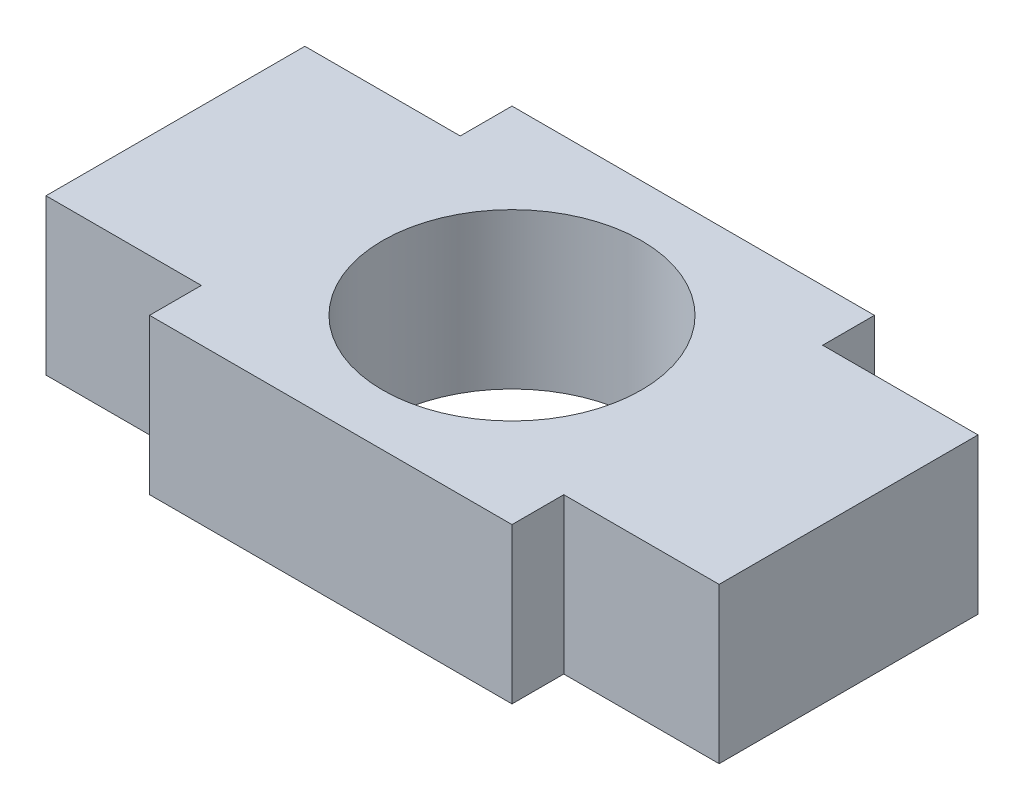
ISO-10303-21;
HEADER;
FILE_DESCRIPTION(('STEP AP214'),'2;1');
FILE_NAME('part.step','',(''),(''),'','','');
FILE_SCHEMA(('AUTOMOTIVE_DESIGN { 1 0 10303 214 1 1 1 1 }'));
ENDSEC;
DATA;
#1=APPLICATION_CONTEXT('core data for automotive mechanical design processes');
#2=APPLICATION_PROTOCOL_DEFINITION('international standard','automotive_design',2000,#1);
#3=PRODUCT_CONTEXT('',#1,'mechanical');
#4=PRODUCT('Part','Part','',(#3));
#5=PRODUCT_RELATED_PRODUCT_CATEGORY('part','',(#4));
#6=PRODUCT_DEFINITION_FORMATION('','',#4);
#7=PRODUCT_DEFINITION_CONTEXT('part definition',#1,'design');
#8=PRODUCT_DEFINITION('design','',#6,#7);
#9=PRODUCT_DEFINITION_SHAPE('','',#8);
#10=(LENGTH_UNIT() NAMED_UNIT(*) SI_UNIT(.MILLI.,.METRE.));
#11=(NAMED_UNIT(*) PLANE_ANGLE_UNIT() SI_UNIT($,.RADIAN.));
#12=(NAMED_UNIT(*) SI_UNIT($,.STERADIAN.) SOLID_ANGLE_UNIT());
#13=UNCERTAINTY_MEASURE_WITH_UNIT(LENGTH_MEASURE(1.E-05),#10,'distance_accuracy_value','');
#14=(GEOMETRIC_REPRESENTATION_CONTEXT(3) GLOBAL_UNCERTAINTY_ASSIGNED_CONTEXT((#13)) GLOBAL_UNIT_ASSIGNED_CONTEXT((#10,
#11,#12)) REPRESENTATION_CONTEXT('',''));
#15=CARTESIAN_POINT('',(0.,0.,0.));
#16=DIRECTION('',(0.,0.,1.));
#17=DIRECTION('',(1.,0.,0.));
#18=AXIS2_PLACEMENT_3D('',#15,#16,#17);
#19=CARTESIAN_POINT('',(-3.5,3.,3.5));
#20=DIRECTION('',(1.,0.,0.));
#21=DIRECTION('',(0.,0.,-1.));
#22=AXIS2_PLACEMENT_3D('',#19,#20,#21);
#23=PLANE('',#22);
#24=DIRECTION('',(0.,1.,0.));
#25=VECTOR('',#24,1.);
#26=CARTESIAN_POINT('',(-3.5,0.,2.5));
#27=LINE('',#26,#25);
#28=CARTESIAN_POINT('',(-3.5,0.,2.5));
#29=VERTEX_POINT('',#28);
#30=CARTESIAN_POINT('',(-3.5,3.,2.5));
#31=VERTEX_POINT('',#30);
#32=EDGE_CURVE('E203',#29,#31,#27,.T.);
#33=ORIENTED_EDGE('',*,*,#32,.F.);
#34=DIRECTION('',(0.,0.,1.));
#35=VECTOR('',#34,1.);
#36=CARTESIAN_POINT('',(-3.5,0.,3.5));
#37=LINE('',#36,#35);
#38=CARTESIAN_POINT('',(-3.5,0.,3.5));
#39=VERTEX_POINT('',#38);
#40=EDGE_CURVE('E152',#29,#39,#37,.T.);
#41=ORIENTED_EDGE('',*,*,#40,.T.);
#42=DIRECTION('',(0.,-1.,0.));
#43=VECTOR('',#42,1.);
#44=CARTESIAN_POINT('',(-3.5,3.,3.5));
#45=LINE('',#44,#43);
#46=CARTESIAN_POINT('',(-3.5,3.,3.5));
#47=VERTEX_POINT('',#46);
#48=EDGE_CURVE('E11',#47,#39,#45,.T.);
#49=ORIENTED_EDGE('',*,*,#48,.F.);
#50=DIRECTION('',(0.,0.,1.));
#51=VECTOR('',#50,1.);
#52=CARTESIAN_POINT('',(-3.5,3.,3.5));
#53=LINE('',#52,#51);
#54=EDGE_CURVE('E166',#31,#47,#53,.T.);
#55=ORIENTED_EDGE('',*,*,#54,.F.);
#56=EDGE_LOOP('',(#33,#41,#49,#55));
#57=FACE_BOUND('',#56,.T.);
#58=ADVANCED_FACE('F39',(#57),#23,.F.);
#59=CARTESIAN_POINT('',(3.5,3.,3.5));
#60=DIRECTION('',(-1.,0.,0.));
#61=DIRECTION('',(0.,0.,1.));
#62=AXIS2_PLACEMENT_3D('',#59,#60,#61);
#63=PLANE('',#62);
#64=DIRECTION('',(0.,1.,0.));
#65=VECTOR('',#64,1.);
#66=CARTESIAN_POINT('',(3.5,0.,-2.5));
#67=LINE('',#66,#65);
#68=CARTESIAN_POINT('',(3.5,0.,-2.5));
#69=VERTEX_POINT('',#68);
#70=CARTESIAN_POINT('',(3.5,3.,-2.5));
#71=VERTEX_POINT('',#70);
#72=EDGE_CURVE('E243',#69,#71,#67,.T.);
#73=ORIENTED_EDGE('',*,*,#72,.F.);
#74=DIRECTION('',(0.,0.,-1.));
#75=VECTOR('',#74,1.);
#76=CARTESIAN_POINT('',(3.5,0.,3.5));
#77=LINE('',#76,#75);
#78=CARTESIAN_POINT('',(3.5,0.,-3.5));
#79=VERTEX_POINT('',#78);
#80=EDGE_CURVE('E154',#69,#79,#77,.T.);
#81=ORIENTED_EDGE('',*,*,#80,.T.);
#82=DIRECTION('',(0.,-1.,0.));
#83=VECTOR('',#82,1.);
#84=CARTESIAN_POINT('',(3.5,3.,-3.5));
#85=LINE('',#84,#83);
#86=CARTESIAN_POINT('',(3.5,3.,-3.5));
#87=VERTEX_POINT('',#86);
#88=EDGE_CURVE('E168',#87,#79,#85,.T.);
#89=ORIENTED_EDGE('',*,*,#88,.F.);
#90=DIRECTION('',(0.,0.,-1.));
#91=VECTOR('',#90,1.);
#92=CARTESIAN_POINT('',(3.5,3.,3.5));
#93=LINE('',#92,#91);
#94=EDGE_CURVE('E207',#71,#87,#93,.T.);
#95=ORIENTED_EDGE('',*,*,#94,.F.);
#96=EDGE_LOOP('',(#73,#81,#89,#95));
#97=FACE_BOUND('',#96,.T.);
#98=ADVANCED_FACE('F217',(#97),#63,.F.);
#99=CARTESIAN_POINT('',(-3.5,0.,-3.5));
#100=VERTEX_POINT('',#99);
#101=CARTESIAN_POINT('',(-3.5,0.,-2.5));
#102=VERTEX_POINT('',#101);
#103=EDGE_CURVE('E142',#100,#102,#37,.T.);
#104=ORIENTED_EDGE('',*,*,#103,.T.);
#105=DIRECTION('',(0.,1.,0.));
#106=VECTOR('',#105,1.);
#107=CARTESIAN_POINT('',(-3.5,0.,-2.5));
#108=LINE('',#107,#106);
#109=CARTESIAN_POINT('',(-3.5,3.,-2.5));
#110=VERTEX_POINT('',#109);
#111=EDGE_CURVE('E126',#102,#110,#108,.T.);
#112=ORIENTED_EDGE('',*,*,#111,.T.);
#113=CARTESIAN_POINT('',(-3.5,3.,-3.5));
#114=VERTEX_POINT('',#113);
#115=EDGE_CURVE('E204',#114,#110,#53,.T.);
#116=ORIENTED_EDGE('',*,*,#115,.F.);
#117=DIRECTION('',(0.,-1.,0.));
#118=VECTOR('',#117,1.);
#119=CARTESIAN_POINT('',(-3.5,3.,-3.5));
#120=LINE('',#119,#118);
#121=EDGE_CURVE('E150',#114,#100,#120,.T.);
#122=ORIENTED_EDGE('',*,*,#121,.T.);
#123=EDGE_LOOP('',(#104,#112,#116,#122));
#124=FACE_BOUND('',#123,.T.);
#125=ADVANCED_FACE('F41',(#124),#23,.F.);
#126=CARTESIAN_POINT('',(3.5,3.,3.5));
#127=DIRECTION('',(0.,0.,-1.));
#128=DIRECTION('',(-1.,0.,0.));
#129=AXIS2_PLACEMENT_3D('',#126,#127,#128);
#130=PLANE('',#129);
#131=DIRECTION('',(1.,0.,0.));
#132=VECTOR('',#131,1.);
#133=CARTESIAN_POINT('',(3.5,0.,3.5));
#134=LINE('',#133,#132);
#135=CARTESIAN_POINT('',(3.5,0.,3.5));
#136=VERTEX_POINT('',#135);
#137=EDGE_CURVE('E151',#39,#136,#134,.T.);
#138=ORIENTED_EDGE('',*,*,#137,.T.);
#139=DIRECTION('',(0.,-1.,0.));
#140=VECTOR('',#139,1.);
#141=CARTESIAN_POINT('',(3.5,3.,3.5));
#142=LINE('',#141,#140);
#143=CARTESIAN_POINT('',(3.5,3.,3.5));
#144=VERTEX_POINT('',#143);
#145=EDGE_CURVE('E47',#144,#136,#142,.T.);
#146=ORIENTED_EDGE('',*,*,#145,.F.);
#147=DIRECTION('',(1.,0.,0.));
#148=VECTOR('',#147,1.);
#149=CARTESIAN_POINT('',(3.5,3.,3.5));
#150=LINE('',#149,#148);
#151=EDGE_CURVE('E206',#47,#144,#150,.T.);
#152=ORIENTED_EDGE('',*,*,#151,.F.);
#153=ORIENTED_EDGE('',*,*,#48,.T.);
#154=EDGE_LOOP('',(#138,#146,#152,#153));
#155=FACE_BOUND('',#154,.T.);
#156=ADVANCED_FACE('F272',(#155),#130,.F.);
#157=CARTESIAN_POINT('',(3.5,0.,2.5));
#158=VERTEX_POINT('',#157);
#159=EDGE_CURVE('E161',#136,#158,#77,.T.);
#160=ORIENTED_EDGE('',*,*,#159,.T.);
#161=DIRECTION('',(0.,1.,0.));
#162=VECTOR('',#161,1.);
#163=CARTESIAN_POINT('',(3.5,0.,2.5));
#164=LINE('',#163,#162);
#165=CARTESIAN_POINT('',(3.5,3.,2.5));
#166=VERTEX_POINT('',#165);
#167=EDGE_CURVE('E237',#158,#166,#164,.T.);
#168=ORIENTED_EDGE('',*,*,#167,.T.);
#169=EDGE_CURVE('E177',#144,#166,#93,.T.);
#170=ORIENTED_EDGE('',*,*,#169,.F.);
#171=ORIENTED_EDGE('',*,*,#145,.T.);
#172=EDGE_LOOP('',(#160,#168,#170,#171));
#173=FACE_BOUND('',#172,.T.);
#174=ADVANCED_FACE('F175',(#173),#63,.F.);
#175=CARTESIAN_POINT('',(3.5,3.,-3.5));
#176=DIRECTION('',(0.,0.,1.));
#177=DIRECTION('',(1.,0.,0.));
#178=AXIS2_PLACEMENT_3D('',#175,#176,#177);
#179=PLANE('',#178);
#180=DIRECTION('',(-1.,0.,0.));
#181=VECTOR('',#180,1.);
#182=CARTESIAN_POINT('',(3.5,0.,-3.5));
#183=LINE('',#182,#181);
#184=EDGE_CURVE('E164',#79,#100,#183,.T.);
#185=ORIENTED_EDGE('',*,*,#184,.T.);
#186=ORIENTED_EDGE('',*,*,#121,.F.);
#187=DIRECTION('',(-1.,0.,0.));
#188=VECTOR('',#187,1.);
#189=CARTESIAN_POINT('',(3.5,3.,-3.5));
#190=LINE('',#189,#188);
#191=EDGE_CURVE('E158',#87,#114,#190,.T.);
#192=ORIENTED_EDGE('',*,*,#191,.F.);
#193=ORIENTED_EDGE('',*,*,#88,.T.);
#194=EDGE_LOOP('',(#185,#186,#192,#193));
#195=FACE_BOUND('',#194,.T.);
#196=ADVANCED_FACE('F220',(#195),#179,.F.);
#197=CARTESIAN_POINT('',(0.,3.,0.));
#198=DIRECTION('',(0.,1.,0.));
#199=DIRECTION('',(0.,0.,1.));
#200=AXIS2_PLACEMENT_3D('',#197,#198,#199);
#201=PLANE('',#200);
#202=CARTESIAN_POINT('',(0.,3.,0.));
#203=DIRECTION('',(0.,1.,0.));
#204=DIRECTION('',(0.,0.,1.));
#205=AXIS2_PLACEMENT_3D('',#202,#203,#204);
#206=CIRCLE('',#205,2.5);
#207=CARTESIAN_POINT('',(0.,3.,2.5));
#208=VERTEX_POINT('',#207);
#209=EDGE_CURVE('E200',#208,#208,#206,.T.);
#210=ORIENTED_EDGE('',*,*,#209,.F.);
#211=EDGE_LOOP('',(#210));
#212=FACE_BOUND('',#211,.T.);
#213=ORIENTED_EDGE('',*,*,#115,.T.);
#214=DIRECTION('',(-1.,0.,0.));
#215=VECTOR('',#214,1.);
#216=CARTESIAN_POINT('',(-3.5,3.,-2.5));
#217=LINE('',#216,#215);
#218=CARTESIAN_POINT('',(-6.5,3.,-2.5));
#219=VERTEX_POINT('',#218);
#220=EDGE_CURVE('E54',#110,#219,#217,.T.);
#221=ORIENTED_EDGE('',*,*,#220,.T.);
#222=DIRECTION('',(0.,0.,1.));
#223=VECTOR('',#222,1.);
#224=CARTESIAN_POINT('',(-6.5,3.,-2.5));
#225=LINE('',#224,#223);
#226=CARTESIAN_POINT('',(-6.5,3.,2.5));
#227=VERTEX_POINT('',#226);
#228=EDGE_CURVE('E224',#219,#227,#225,.T.);
#229=ORIENTED_EDGE('',*,*,#228,.T.);
#230=DIRECTION('',(1.,0.,0.));
#231=VECTOR('',#230,1.);
#232=CARTESIAN_POINT('',(-3.5,3.,2.5));
#233=LINE('',#232,#231);
#234=EDGE_CURVE('E146',#227,#31,#233,.T.);
#235=ORIENTED_EDGE('',*,*,#234,.T.);
#236=ORIENTED_EDGE('',*,*,#54,.T.);
#237=ORIENTED_EDGE('',*,*,#151,.T.);
#238=ORIENTED_EDGE('',*,*,#169,.T.);
#239=DIRECTION('',(1.,0.,0.));
#240=VECTOR('',#239,1.);
#241=CARTESIAN_POINT('',(3.5,3.,2.5));
#242=LINE('',#241,#240);
#243=CARTESIAN_POINT('',(6.5,3.,2.5));
#244=VERTEX_POINT('',#243);
#245=EDGE_CURVE('E62',#166,#244,#242,.T.);
#246=ORIENTED_EDGE('',*,*,#245,.T.);
#247=DIRECTION('',(0.,0.,-1.));
#248=VECTOR('',#247,1.);
#249=CARTESIAN_POINT('',(6.5,3.,-2.5));
#250=LINE('',#249,#248);
#251=CARTESIAN_POINT('',(6.5,3.,-2.5));
#252=VERTEX_POINT('',#251);
#253=EDGE_CURVE('E192',#244,#252,#250,.T.);
#254=ORIENTED_EDGE('',*,*,#253,.T.);
#255=DIRECTION('',(-1.,0.,0.));
#256=VECTOR('',#255,1.);
#257=CARTESIAN_POINT('',(3.5,3.,-2.5));
#258=LINE('',#257,#256);
#259=EDGE_CURVE('E189',#252,#71,#258,.T.);
#260=ORIENTED_EDGE('',*,*,#259,.T.);
#261=ORIENTED_EDGE('',*,*,#94,.T.);
#262=ORIENTED_EDGE('',*,*,#191,.T.);
#263=EDGE_LOOP('',(#213,#221,#229,#235,#236,#237,#238,#246,#254,#260,#261,#262));
#264=FACE_BOUND('',#263,.T.);
#265=ADVANCED_FACE('F211',(#212,#264),#201,.T.);
#266=CARTESIAN_POINT('',(0.,0.,0.));
#267=DIRECTION('',(0.,1.,0.));
#268=DIRECTION('',(0.,0.,1.));
#269=AXIS2_PLACEMENT_3D('',#266,#267,#268);
#270=PLANE('',#269);
#271=CARTESIAN_POINT('',(0.,0.,0.));
#272=DIRECTION('',(0.,1.,0.));
#273=DIRECTION('',(0.,0.,1.));
#274=AXIS2_PLACEMENT_3D('',#271,#272,#273);
#275=CIRCLE('',#274,2.5);
#276=CARTESIAN_POINT('',(0.,0.,2.5));
#277=VERTEX_POINT('',#276);
#278=EDGE_CURVE('E156',#277,#277,#275,.T.);
#279=ORIENTED_EDGE('',*,*,#278,.T.);
#280=EDGE_LOOP('',(#279));
#281=FACE_BOUND('',#280,.T.);
#282=ORIENTED_EDGE('',*,*,#103,.F.);
#283=ORIENTED_EDGE('',*,*,#184,.F.);
#284=ORIENTED_EDGE('',*,*,#80,.F.);
#285=DIRECTION('',(-1.,0.,0.));
#286=VECTOR('',#285,1.);
#287=CARTESIAN_POINT('',(3.5,0.,-2.5));
#288=LINE('',#287,#286);
#289=CARTESIAN_POINT('',(6.5,0.,-2.5));
#290=VERTEX_POINT('',#289);
#291=EDGE_CURVE('E194',#290,#69,#288,.T.);
#292=ORIENTED_EDGE('',*,*,#291,.F.);
#293=DIRECTION('',(0.,0.,-1.));
#294=VECTOR('',#293,1.);
#295=CARTESIAN_POINT('',(6.5,0.,-2.5));
#296=LINE('',#295,#294);
#297=CARTESIAN_POINT('',(6.5,0.,2.5));
#298=VERTEX_POINT('',#297);
#299=EDGE_CURVE('E188',#298,#290,#296,.T.);
#300=ORIENTED_EDGE('',*,*,#299,.F.);
#301=DIRECTION('',(1.,0.,0.));
#302=VECTOR('',#301,1.);
#303=CARTESIAN_POINT('',(3.5,0.,2.5));
#304=LINE('',#303,#302);
#305=EDGE_CURVE('E185',#158,#298,#304,.T.);
#306=ORIENTED_EDGE('',*,*,#305,.F.);
#307=ORIENTED_EDGE('',*,*,#159,.F.);
#308=ORIENTED_EDGE('',*,*,#137,.F.);
#309=ORIENTED_EDGE('',*,*,#40,.F.);
#310=DIRECTION('',(1.,0.,0.));
#311=VECTOR('',#310,1.);
#312=CARTESIAN_POINT('',(-3.5,0.,2.5));
#313=LINE('',#312,#311);
#314=CARTESIAN_POINT('',(-6.5,0.,2.5));
#315=VERTEX_POINT('',#314);
#316=EDGE_CURVE('E135',#315,#29,#313,.T.);
#317=ORIENTED_EDGE('',*,*,#316,.F.);
#318=DIRECTION('',(0.,0.,1.));
#319=VECTOR('',#318,1.);
#320=CARTESIAN_POINT('',(-6.5,0.,-2.5));
#321=LINE('',#320,#319);
#322=CARTESIAN_POINT('',(-6.5,0.,-2.5));
#323=VERTEX_POINT('',#322);
#324=EDGE_CURVE('E145',#323,#315,#321,.T.);
#325=ORIENTED_EDGE('',*,*,#324,.F.);
#326=DIRECTION('',(-1.,0.,0.));
#327=VECTOR('',#326,1.);
#328=CARTESIAN_POINT('',(-3.5,0.,-2.5));
#329=LINE('',#328,#327);
#330=EDGE_CURVE('E129',#102,#323,#329,.T.);
#331=ORIENTED_EDGE('',*,*,#330,.F.);
#332=EDGE_LOOP('',(#282,#283,#284,#292,#300,#306,#307,#308,#309,#317,#325,#331));
#333=FACE_BOUND('',#332,.T.);
#334=ADVANCED_FACE('F140',(#281,#333),#270,.F.);
#335=CARTESIAN_POINT('',(0.,0.,0.));
#336=DIRECTION('',(0.,1.,0.));
#337=DIRECTION('',(0.,0.,1.));
#338=AXIS2_PLACEMENT_3D('',#335,#336,#337);
#339=CYLINDRICAL_SURFACE('',#338,2.5);
#340=ORIENTED_EDGE('',*,*,#278,.F.);
#341=EDGE_LOOP('',(#340));
#342=FACE_BOUND('',#341,.T.);
#343=ORIENTED_EDGE('',*,*,#209,.T.);
#344=EDGE_LOOP('',(#343));
#345=FACE_BOUND('',#344,.T.);
#346=ADVANCED_FACE('F284',(#342,#345),#339,.F.);
#347=CARTESIAN_POINT('',(3.5,0.,-2.5));
#348=DIRECTION('',(0.,0.,-1.));
#349=DIRECTION('',(-1.,0.,0.));
#350=AXIS2_PLACEMENT_3D('',#347,#348,#349);
#351=PLANE('',#350);
#352=ORIENTED_EDGE('',*,*,#259,.F.);
#353=DIRECTION('',(0.,1.,0.));
#354=VECTOR('',#353,1.);
#355=CARTESIAN_POINT('',(6.5,0.,-2.5));
#356=LINE('',#355,#354);
#357=EDGE_CURVE('E241',#290,#252,#356,.T.);
#358=ORIENTED_EDGE('',*,*,#357,.F.);
#359=ORIENTED_EDGE('',*,*,#291,.T.);
#360=ORIENTED_EDGE('',*,*,#72,.T.);
#361=EDGE_LOOP('',(#352,#358,#359,#360));
#362=FACE_BOUND('',#361,.T.);
#363=ADVANCED_FACE('F246',(#362),#351,.T.);
#364=CARTESIAN_POINT('',(6.5,0.,-2.5));
#365=DIRECTION('',(1.,0.,0.));
#366=DIRECTION('',(0.,0.,-1.));
#367=AXIS2_PLACEMENT_3D('',#364,#365,#366);
#368=PLANE('',#367);
#369=ORIENTED_EDGE('',*,*,#253,.F.);
#370=DIRECTION('',(0.,1.,0.));
#371=VECTOR('',#370,1.);
#372=CARTESIAN_POINT('',(6.5,0.,2.5));
#373=LINE('',#372,#371);
#374=EDGE_CURVE('E239',#298,#244,#373,.T.);
#375=ORIENTED_EDGE('',*,*,#374,.F.);
#376=ORIENTED_EDGE('',*,*,#299,.T.);
#377=ORIENTED_EDGE('',*,*,#357,.T.);
#378=EDGE_LOOP('',(#369,#375,#376,#377));
#379=FACE_BOUND('',#378,.T.);
#380=ADVANCED_FACE('F249',(#379),#368,.T.);
#381=CARTESIAN_POINT('',(3.5,0.,2.5));
#382=DIRECTION('',(0.,0.,1.));
#383=DIRECTION('',(1.,0.,0.));
#384=AXIS2_PLACEMENT_3D('',#381,#382,#383);
#385=PLANE('',#384);
#386=ORIENTED_EDGE('',*,*,#245,.F.);
#387=ORIENTED_EDGE('',*,*,#167,.F.);
#388=ORIENTED_EDGE('',*,*,#305,.T.);
#389=ORIENTED_EDGE('',*,*,#374,.T.);
#390=EDGE_LOOP('',(#386,#387,#388,#389));
#391=FACE_BOUND('',#390,.T.);
#392=ADVANCED_FACE('F250',(#391),#385,.T.);
#393=CARTESIAN_POINT('',(-3.5,0.,2.5));
#394=DIRECTION('',(0.,0.,1.));
#395=DIRECTION('',(1.,0.,0.));
#396=AXIS2_PLACEMENT_3D('',#393,#394,#395);
#397=PLANE('',#396);
#398=ORIENTED_EDGE('',*,*,#234,.F.);
#399=DIRECTION('',(0.,1.,0.));
#400=VECTOR('',#399,1.);
#401=CARTESIAN_POINT('',(-6.5,0.,2.5));
#402=LINE('',#401,#400);
#403=EDGE_CURVE('E234',#315,#227,#402,.T.);
#404=ORIENTED_EDGE('',*,*,#403,.F.);
#405=ORIENTED_EDGE('',*,*,#316,.T.);
#406=ORIENTED_EDGE('',*,*,#32,.T.);
#407=EDGE_LOOP('',(#398,#404,#405,#406));
#408=FACE_BOUND('',#407,.T.);
#409=ADVANCED_FACE('F252',(#408),#397,.T.);
#410=CARTESIAN_POINT('',(-6.5,0.,-2.5));
#411=DIRECTION('',(-1.,0.,0.));
#412=DIRECTION('',(0.,0.,1.));
#413=AXIS2_PLACEMENT_3D('',#410,#411,#412);
#414=PLANE('',#413);
#415=ORIENTED_EDGE('',*,*,#228,.F.);
#416=DIRECTION('',(0.,1.,0.));
#417=VECTOR('',#416,1.);
#418=CARTESIAN_POINT('',(-6.5,0.,-2.5));
#419=LINE('',#418,#417);
#420=EDGE_CURVE('E134',#323,#219,#419,.T.);
#421=ORIENTED_EDGE('',*,*,#420,.F.);
#422=ORIENTED_EDGE('',*,*,#324,.T.);
#423=ORIENTED_EDGE('',*,*,#403,.T.);
#424=EDGE_LOOP('',(#415,#421,#422,#423));
#425=FACE_BOUND('',#424,.T.);
#426=ADVANCED_FACE('F258',(#425),#414,.T.);
#427=CARTESIAN_POINT('',(-3.5,0.,-2.5));
#428=DIRECTION('',(0.,0.,-1.));
#429=DIRECTION('',(-1.,0.,0.));
#430=AXIS2_PLACEMENT_3D('',#427,#428,#429);
#431=PLANE('',#430);
#432=ORIENTED_EDGE('',*,*,#220,.F.);
#433=ORIENTED_EDGE('',*,*,#111,.F.);
#434=ORIENTED_EDGE('',*,*,#330,.T.);
#435=ORIENTED_EDGE('',*,*,#420,.T.);
#436=EDGE_LOOP('',(#432,#433,#434,#435));
#437=FACE_BOUND('',#436,.T.);
#438=ADVANCED_FACE('F128',(#437),#431,.T.);
#439=CLOSED_SHELL('',(#58,#98,#125,#156,#174,#196,#265,#334,#346,#363,#380,#392,#409,#426,#438));
#440=MANIFOLD_SOLID_BREP('B2',#439);
#441=ADVANCED_BREP_SHAPE_REPRESENTATION('',(#18,#440),#14);
#442=SHAPE_DEFINITION_REPRESENTATION(#9,#441);
ENDSEC;
END-ISO-10303-21;
